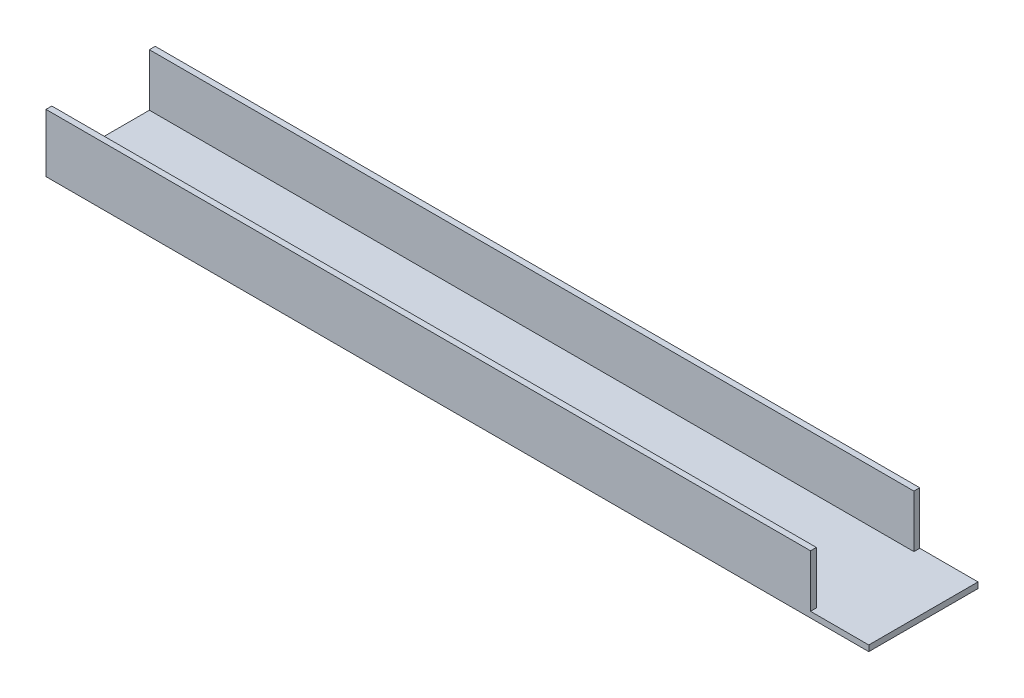
ISO-10303-21;
HEADER;
FILE_DESCRIPTION(('STEP AP214'),'2;1');
FILE_NAME('part.step','',(''),(''),'','','');
FILE_SCHEMA(('AUTOMOTIVE_DESIGN { 1 0 10303 214 1 1 1 1 }'));
ENDSEC;
DATA;
#1=APPLICATION_CONTEXT('core data for automotive mechanical design processes');
#2=APPLICATION_PROTOCOL_DEFINITION('international standard','automotive_design',2000,#1);
#3=PRODUCT_CONTEXT('',#1,'mechanical');
#4=PRODUCT('Part','Part','',(#3));
#5=PRODUCT_RELATED_PRODUCT_CATEGORY('part','',(#4));
#6=PRODUCT_DEFINITION_FORMATION('','',#4);
#7=PRODUCT_DEFINITION_CONTEXT('part definition',#1,'design');
#8=PRODUCT_DEFINITION('design','',#6,#7);
#9=PRODUCT_DEFINITION_SHAPE('','',#8);
#10=(LENGTH_UNIT() NAMED_UNIT(*) SI_UNIT(.MILLI.,.METRE.));
#11=(NAMED_UNIT(*) PLANE_ANGLE_UNIT() SI_UNIT($,.RADIAN.));
#12=(NAMED_UNIT(*) SI_UNIT($,.STERADIAN.) SOLID_ANGLE_UNIT());
#13=UNCERTAINTY_MEASURE_WITH_UNIT(LENGTH_MEASURE(1.E-05),#10,'distance_accuracy_value','');
#14=(GEOMETRIC_REPRESENTATION_CONTEXT(3) GLOBAL_UNCERTAINTY_ASSIGNED_CONTEXT((#13)) GLOBAL_UNIT_ASSIGNED_CONTEXT((#10,
#11,#12)) REPRESENTATION_CONTEXT('',''));
#15=CARTESIAN_POINT('',(0.,0.,0.));
#16=DIRECTION('',(0.,0.,1.));
#17=DIRECTION('',(1.,0.,0.));
#18=AXIS2_PLACEMENT_3D('',#15,#16,#17);
#19=CARTESIAN_POINT('',(0.,4.,0.));
#20=DIRECTION('',(0.,-1.,0.));
#21=DIRECTION('',(0.,0.,-1.));
#22=AXIS2_PLACEMENT_3D('',#19,#20,#21);
#23=PLANE('',#22);
#24=DIRECTION('',(0.,0.,-1.));
#25=VECTOR('',#24,1.);
#26=CARTESIAN_POINT('',(525.,4.,-75.));
#27=LINE('',#26,#25);
#28=CARTESIAN_POINT('',(525.,4.,-71.));
#29=VERTEX_POINT('',#28);
#30=CARTESIAN_POINT('',(525.,4.,-75.));
#31=VERTEX_POINT('',#30);
#32=EDGE_CURVE('E61',#29,#31,#27,.T.);
#33=ORIENTED_EDGE('',*,*,#32,.F.);
#34=DIRECTION('',(1.,0.,0.));
#35=VECTOR('',#34,1.);
#36=CARTESIAN_POINT('',(525.,4.,-71.));
#37=LINE('',#36,#35);
#38=CARTESIAN_POINT('',(0.,4.,-70.9999999999999));
#39=VERTEX_POINT('',#38);
#40=EDGE_CURVE('E65',#39,#29,#37,.T.);
#41=ORIENTED_EDGE('',*,*,#40,.F.);
#42=DIRECTION('',(0.,0.,1.));
#43=VECTOR('',#42,1.);
#44=CARTESIAN_POINT('',(0.,4.,0.));
#45=LINE('',#44,#43);
#46=CARTESIAN_POINT('',(0.,4.,-4.));
#47=VERTEX_POINT('',#46);
#48=EDGE_CURVE('E188',#39,#47,#45,.T.);
#49=ORIENTED_EDGE('',*,*,#48,.T.);
#50=DIRECTION('',(-1.,0.,0.));
#51=VECTOR('',#50,1.);
#52=CARTESIAN_POINT('',(0.,4.,-4.));
#53=LINE('',#52,#51);
#54=CARTESIAN_POINT('',(525.,4.,-4.));
#55=VERTEX_POINT('',#54);
#56=EDGE_CURVE('E159',#55,#47,#53,.T.);
#57=ORIENTED_EDGE('',*,*,#56,.F.);
#58=DIRECTION('',(0.,0.,-1.));
#59=VECTOR('',#58,1.);
#60=CARTESIAN_POINT('',(525.,4.,0.));
#61=LINE('',#60,#59);
#62=CARTESIAN_POINT('',(525.,4.,0.));
#63=VERTEX_POINT('',#62);
#64=EDGE_CURVE('E169',#63,#55,#61,.T.);
#65=ORIENTED_EDGE('',*,*,#64,.F.);
#66=DIRECTION('',(1.,0.,0.));
#67=VECTOR('',#66,1.);
#68=CARTESIAN_POINT('',(0.,4.,0.));
#69=LINE('',#68,#67);
#70=CARTESIAN_POINT('',(565.,4.,0.));
#71=VERTEX_POINT('',#70);
#72=EDGE_CURVE('E191',#63,#71,#69,.T.);
#73=ORIENTED_EDGE('',*,*,#72,.T.);
#74=DIRECTION('',(0.,0.,-1.));
#75=VECTOR('',#74,1.);
#76=CARTESIAN_POINT('',(565.,4.,0.));
#77=LINE('',#76,#75);
#78=CARTESIAN_POINT('',(565.,4.,-75.));
#79=VERTEX_POINT('',#78);
#80=EDGE_CURVE('E195',#71,#79,#77,.T.);
#81=ORIENTED_EDGE('',*,*,#80,.T.);
#82=DIRECTION('',(-1.,0.,0.));
#83=VECTOR('',#82,1.);
#84=CARTESIAN_POINT('',(0.,4.,-75.));
#85=LINE('',#84,#83);
#86=EDGE_CURVE('E198',#79,#31,#85,.T.);
#87=ORIENTED_EDGE('',*,*,#86,.T.);
#88=EDGE_LOOP('',(#33,#41,#49,#57,#65,#73,#81,#87));
#89=FACE_BOUND('',#88,.T.);
#90=ADVANCED_FACE('F45',(#89),#23,.F.);
#91=CARTESIAN_POINT('',(0.,4.,0.));
#92=DIRECTION('',(1.,0.,0.));
#93=DIRECTION('',(0.,0.,-1.));
#94=AXIS2_PLACEMENT_3D('',#91,#92,#93);
#95=PLANE('',#94);
#96=DIRECTION('',(0.,0.,1.));
#97=VECTOR('',#96,1.);
#98=CARTESIAN_POINT('',(0.,0.,0.));
#99=LINE('',#98,#97);
#100=CARTESIAN_POINT('',(0.,0.,-75.));
#101=VERTEX_POINT('',#100);
#102=CARTESIAN_POINT('',(0.,0.,0.));
#103=VERTEX_POINT('',#102);
#104=EDGE_CURVE('E187',#101,#103,#99,.T.);
#105=ORIENTED_EDGE('',*,*,#104,.T.);
#106=DIRECTION('',(0.,-1.,0.));
#107=VECTOR('',#106,1.);
#108=CARTESIAN_POINT('',(0.,4.,0.));
#109=LINE('',#108,#107);
#110=CARTESIAN_POINT('',(0.,40.,0.));
#111=VERTEX_POINT('',#110);
#112=EDGE_CURVE('E11',#111,#103,#109,.T.);
#113=ORIENTED_EDGE('',*,*,#112,.F.);
#114=DIRECTION('',(0.,0.,1.));
#115=VECTOR('',#114,1.);
#116=CARTESIAN_POINT('',(0.,40.,0.));
#117=LINE('',#116,#115);
#118=CARTESIAN_POINT('',(0.,40.,-4.));
#119=VERTEX_POINT('',#118);
#120=EDGE_CURVE('E154',#119,#111,#117,.T.);
#121=ORIENTED_EDGE('',*,*,#120,.F.);
#122=DIRECTION('',(0.,-1.,0.));
#123=VECTOR('',#122,1.);
#124=CARTESIAN_POINT('',(0.,40.,-4.));
#125=LINE('',#124,#123);
#126=EDGE_CURVE('E168',#119,#47,#125,.T.);
#127=ORIENTED_EDGE('',*,*,#126,.T.);
#128=ORIENTED_EDGE('',*,*,#48,.F.);
#129=DIRECTION('',(0.,-1.,0.));
#130=VECTOR('',#129,1.);
#131=CARTESIAN_POINT('',(0.,40.,-70.9999999999999));
#132=LINE('',#131,#130);
#133=CARTESIAN_POINT('',(0.,40.,-70.9999999999999));
#134=VERTEX_POINT('',#133);
#135=EDGE_CURVE('E140',#134,#39,#132,.T.);
#136=ORIENTED_EDGE('',*,*,#135,.F.);
#137=DIRECTION('',(0.,0.,1.));
#138=VECTOR('',#137,1.);
#139=CARTESIAN_POINT('',(0.,40.,-75.));
#140=LINE('',#139,#138);
#141=CARTESIAN_POINT('',(0.,40.,-75.));
#142=VERTEX_POINT('',#141);
#143=EDGE_CURVE('E129',#142,#134,#140,.T.);
#144=ORIENTED_EDGE('',*,*,#143,.F.);
#145=DIRECTION('',(0.,-1.,0.));
#146=VECTOR('',#145,1.);
#147=CARTESIAN_POINT('',(0.,4.,-75.));
#148=LINE('',#147,#146);
#149=EDGE_CURVE('E201',#142,#101,#148,.T.);
#150=ORIENTED_EDGE('',*,*,#149,.T.);
#151=EDGE_LOOP('',(#105,#113,#121,#127,#128,#136,#144,#150));
#152=FACE_BOUND('',#151,.T.);
#153=ADVANCED_FACE('F47',(#152),#95,.F.);
#154=CARTESIAN_POINT('',(0.,4.,0.));
#155=DIRECTION('',(0.,0.,-1.));
#156=DIRECTION('',(-1.,0.,0.));
#157=AXIS2_PLACEMENT_3D('',#154,#155,#156);
#158=PLANE('',#157);
#159=DIRECTION('',(1.,0.,0.));
#160=VECTOR('',#159,1.);
#161=CARTESIAN_POINT('',(0.,0.,0.));
#162=LINE('',#161,#160);
#163=CARTESIAN_POINT('',(565.,0.,0.));
#164=VERTEX_POINT('',#163);
#165=EDGE_CURVE('E205',#103,#164,#162,.T.);
#166=ORIENTED_EDGE('',*,*,#165,.T.);
#167=DIRECTION('',(0.,-1.,0.));
#168=VECTOR('',#167,1.);
#169=CARTESIAN_POINT('',(565.,4.,0.));
#170=LINE('',#169,#168);
#171=EDGE_CURVE('E54',#71,#164,#170,.T.);
#172=ORIENTED_EDGE('',*,*,#171,.F.);
#173=ORIENTED_EDGE('',*,*,#72,.F.);
#174=DIRECTION('',(0.,-1.,0.));
#175=VECTOR('',#174,1.);
#176=CARTESIAN_POINT('',(525.,40.,0.));
#177=LINE('',#176,#175);
#178=CARTESIAN_POINT('',(525.,40.,0.));
#179=VERTEX_POINT('',#178);
#180=EDGE_CURVE('E183',#179,#63,#177,.T.);
#181=ORIENTED_EDGE('',*,*,#180,.F.);
#182=DIRECTION('',(1.,0.,0.));
#183=VECTOR('',#182,1.);
#184=CARTESIAN_POINT('',(0.,40.,0.));
#185=LINE('',#184,#183);
#186=EDGE_CURVE('E158',#111,#179,#185,.T.);
#187=ORIENTED_EDGE('',*,*,#186,.F.);
#188=ORIENTED_EDGE('',*,*,#112,.T.);
#189=EDGE_LOOP('',(#166,#172,#173,#181,#187,#188));
#190=FACE_BOUND('',#189,.T.);
#191=ADVANCED_FACE('F245',(#190),#158,.F.);
#192=CARTESIAN_POINT('',(565.,4.,0.));
#193=DIRECTION('',(-1.,0.,0.));
#194=DIRECTION('',(0.,0.,1.));
#195=AXIS2_PLACEMENT_3D('',#192,#193,#194);
#196=PLANE('',#195);
#197=DIRECTION('',(0.,0.,-1.));
#198=VECTOR('',#197,1.);
#199=CARTESIAN_POINT('',(565.,0.,0.));
#200=LINE('',#199,#198);
#201=CARTESIAN_POINT('',(565.,0.,-75.));
#202=VERTEX_POINT('',#201);
#203=EDGE_CURVE('E208',#164,#202,#200,.T.);
#204=ORIENTED_EDGE('',*,*,#203,.T.);
#205=DIRECTION('',(0.,-1.,0.));
#206=VECTOR('',#205,1.);
#207=CARTESIAN_POINT('',(565.,4.,-75.));
#208=LINE('',#207,#206);
#209=EDGE_CURVE('E216',#79,#202,#208,.T.);
#210=ORIENTED_EDGE('',*,*,#209,.F.);
#211=ORIENTED_EDGE('',*,*,#80,.F.);
#212=ORIENTED_EDGE('',*,*,#171,.T.);
#213=EDGE_LOOP('',(#204,#210,#211,#212));
#214=FACE_BOUND('',#213,.T.);
#215=ADVANCED_FACE('F225',(#214),#196,.F.);
#216=CARTESIAN_POINT('',(0.,4.,-75.));
#217=DIRECTION('',(0.,0.,1.));
#218=DIRECTION('',(1.,0.,0.));
#219=AXIS2_PLACEMENT_3D('',#216,#217,#218);
#220=PLANE('',#219);
#221=DIRECTION('',(-1.,0.,0.));
#222=VECTOR('',#221,1.);
#223=CARTESIAN_POINT('',(0.,0.,-75.));
#224=LINE('',#223,#222);
#225=EDGE_CURVE('E192',#202,#101,#224,.T.);
#226=ORIENTED_EDGE('',*,*,#225,.T.);
#227=ORIENTED_EDGE('',*,*,#149,.F.);
#228=DIRECTION('',(-1.,0.,0.));
#229=VECTOR('',#228,1.);
#230=CARTESIAN_POINT('',(525.,40.,-75.));
#231=LINE('',#230,#229);
#232=CARTESIAN_POINT('',(525.,40.,-75.));
#233=VERTEX_POINT('',#232);
#234=EDGE_CURVE('E146',#233,#142,#231,.T.);
#235=ORIENTED_EDGE('',*,*,#234,.F.);
#236=DIRECTION('',(0.,-1.,0.));
#237=VECTOR('',#236,1.);
#238=CARTESIAN_POINT('',(525.,40.,-75.));
#239=LINE('',#238,#237);
#240=EDGE_CURVE('E144',#233,#31,#239,.T.);
#241=ORIENTED_EDGE('',*,*,#240,.T.);
#242=ORIENTED_EDGE('',*,*,#86,.F.);
#243=ORIENTED_EDGE('',*,*,#209,.T.);
#244=EDGE_LOOP('',(#226,#227,#235,#241,#242,#243));
#245=FACE_BOUND('',#244,.T.);
#246=ADVANCED_FACE('F234',(#245),#220,.F.);
#247=CARTESIAN_POINT('',(0.,0.,0.));
#248=DIRECTION('',(0.,-1.,0.));
#249=DIRECTION('',(0.,0.,-1.));
#250=AXIS2_PLACEMENT_3D('',#247,#248,#249);
#251=PLANE('',#250);
#252=ORIENTED_EDGE('',*,*,#104,.F.);
#253=ORIENTED_EDGE('',*,*,#225,.F.);
#254=ORIENTED_EDGE('',*,*,#203,.F.);
#255=ORIENTED_EDGE('',*,*,#165,.F.);
#256=EDGE_LOOP('',(#252,#253,#254,#255));
#257=FACE_BOUND('',#256,.T.);
#258=ADVANCED_FACE('F232',(#257),#251,.T.);
#259=CARTESIAN_POINT('',(525.,40.,0.));
#260=DIRECTION('',(-1.,0.,0.));
#261=DIRECTION('',(0.,0.,1.));
#262=AXIS2_PLACEMENT_3D('',#259,#260,#261);
#263=PLANE('',#262);
#264=ORIENTED_EDGE('',*,*,#64,.T.);
#265=DIRECTION('',(0.,-1.,0.));
#266=VECTOR('',#265,1.);
#267=CARTESIAN_POINT('',(525.,40.,-4.));
#268=LINE('',#267,#266);
#269=CARTESIAN_POINT('',(525.,40.,-4.));
#270=VERTEX_POINT('',#269);
#271=EDGE_CURVE('E179',#270,#55,#268,.T.);
#272=ORIENTED_EDGE('',*,*,#271,.F.);
#273=DIRECTION('',(0.,0.,-1.));
#274=VECTOR('',#273,1.);
#275=CARTESIAN_POINT('',(525.,40.,0.));
#276=LINE('',#275,#274);
#277=EDGE_CURVE('E162',#179,#270,#276,.T.);
#278=ORIENTED_EDGE('',*,*,#277,.F.);
#279=ORIENTED_EDGE('',*,*,#180,.T.);
#280=EDGE_LOOP('',(#264,#272,#278,#279));
#281=FACE_BOUND('',#280,.T.);
#282=ADVANCED_FACE('F249',(#281),#263,.F.);
#283=CARTESIAN_POINT('',(0.,40.,-4.));
#284=DIRECTION('',(0.,0.,1.));
#285=DIRECTION('',(1.,0.,0.));
#286=AXIS2_PLACEMENT_3D('',#283,#284,#285);
#287=PLANE('',#286);
#288=ORIENTED_EDGE('',*,*,#56,.T.);
#289=ORIENTED_EDGE('',*,*,#126,.F.);
#290=DIRECTION('',(-1.,0.,0.));
#291=VECTOR('',#290,1.);
#292=CARTESIAN_POINT('',(0.,40.,-4.));
#293=LINE('',#292,#291);
#294=EDGE_CURVE('E165',#270,#119,#293,.T.);
#295=ORIENTED_EDGE('',*,*,#294,.F.);
#296=ORIENTED_EDGE('',*,*,#271,.T.);
#297=EDGE_LOOP('',(#288,#289,#295,#296));
#298=FACE_BOUND('',#297,.T.);
#299=ADVANCED_FACE('F257',(#298),#287,.F.);
#300=CARTESIAN_POINT('',(0.,40.,0.));
#301=DIRECTION('',(0.,-1.,0.));
#302=DIRECTION('',(0.,0.,-1.));
#303=AXIS2_PLACEMENT_3D('',#300,#301,#302);
#304=PLANE('',#303);
#305=ORIENTED_EDGE('',*,*,#120,.T.);
#306=ORIENTED_EDGE('',*,*,#186,.T.);
#307=ORIENTED_EDGE('',*,*,#277,.T.);
#308=ORIENTED_EDGE('',*,*,#294,.T.);
#309=EDGE_LOOP('',(#305,#306,#307,#308));
#310=FACE_BOUND('',#309,.T.);
#311=ADVANCED_FACE('F253',(#310),#304,.F.);
#312=CARTESIAN_POINT('',(525.,40.,-75.));
#313=DIRECTION('',(-1.,0.,0.));
#314=DIRECTION('',(0.,0.,1.));
#315=AXIS2_PLACEMENT_3D('',#312,#313,#314);
#316=PLANE('',#315);
#317=ORIENTED_EDGE('',*,*,#32,.T.);
#318=ORIENTED_EDGE('',*,*,#240,.F.);
#319=DIRECTION('',(0.,0.,-1.));
#320=VECTOR('',#319,1.);
#321=CARTESIAN_POINT('',(525.,40.,-75.));
#322=LINE('',#321,#320);
#323=CARTESIAN_POINT('',(525.,40.,-71.));
#324=VERTEX_POINT('',#323);
#325=EDGE_CURVE('E126',#324,#233,#322,.T.);
#326=ORIENTED_EDGE('',*,*,#325,.F.);
#327=DIRECTION('',(0.,-1.,0.));
#328=VECTOR('',#327,1.);
#329=CARTESIAN_POINT('',(525.,40.,-71.));
#330=LINE('',#329,#328);
#331=EDGE_CURVE('E134',#324,#29,#330,.T.);
#332=ORIENTED_EDGE('',*,*,#331,.T.);
#333=EDGE_LOOP('',(#317,#318,#326,#332));
#334=FACE_BOUND('',#333,.T.);
#335=ADVANCED_FACE('F142',(#334),#316,.F.);
#336=CARTESIAN_POINT('',(525.,40.,-71.));
#337=DIRECTION('',(0.,0.,-1.));
#338=DIRECTION('',(-1.,0.,0.));
#339=AXIS2_PLACEMENT_3D('',#336,#337,#338);
#340=PLANE('',#339);
#341=ORIENTED_EDGE('',*,*,#40,.T.);
#342=ORIENTED_EDGE('',*,*,#331,.F.);
#343=DIRECTION('',(1.,0.,0.));
#344=VECTOR('',#343,1.);
#345=CARTESIAN_POINT('',(525.,40.,-71.));
#346=LINE('',#345,#344);
#347=EDGE_CURVE('E121',#134,#324,#346,.T.);
#348=ORIENTED_EDGE('',*,*,#347,.F.);
#349=ORIENTED_EDGE('',*,*,#135,.T.);
#350=EDGE_LOOP('',(#341,#342,#348,#349));
#351=FACE_BOUND('',#350,.T.);
#352=ADVANCED_FACE('F137',(#351),#340,.F.);
#353=CARTESIAN_POINT('',(0.,40.,0.));
#354=DIRECTION('',(0.,-1.,0.));
#355=DIRECTION('',(0.,0.,-1.));
#356=AXIS2_PLACEMENT_3D('',#353,#354,#355);
#357=PLANE('',#356);
#358=ORIENTED_EDGE('',*,*,#325,.T.);
#359=ORIENTED_EDGE('',*,*,#234,.T.);
#360=ORIENTED_EDGE('',*,*,#143,.T.);
#361=ORIENTED_EDGE('',*,*,#347,.T.);
#362=EDGE_LOOP('',(#358,#359,#360,#361));
#363=FACE_BOUND('',#362,.T.);
#364=ADVANCED_FACE('F123',(#363),#357,.F.);
#365=CLOSED_SHELL('',(#90,#153,#191,#215,#246,#258,#282,#299,#311,#335,#352,#364));
#366=MANIFOLD_SOLID_BREP('B2',#365);
#367=ADVANCED_BREP_SHAPE_REPRESENTATION('',(#18,#366),#14);
#368=SHAPE_DEFINITION_REPRESENTATION(#9,#367);
ENDSEC;
END-ISO-10303-21;
